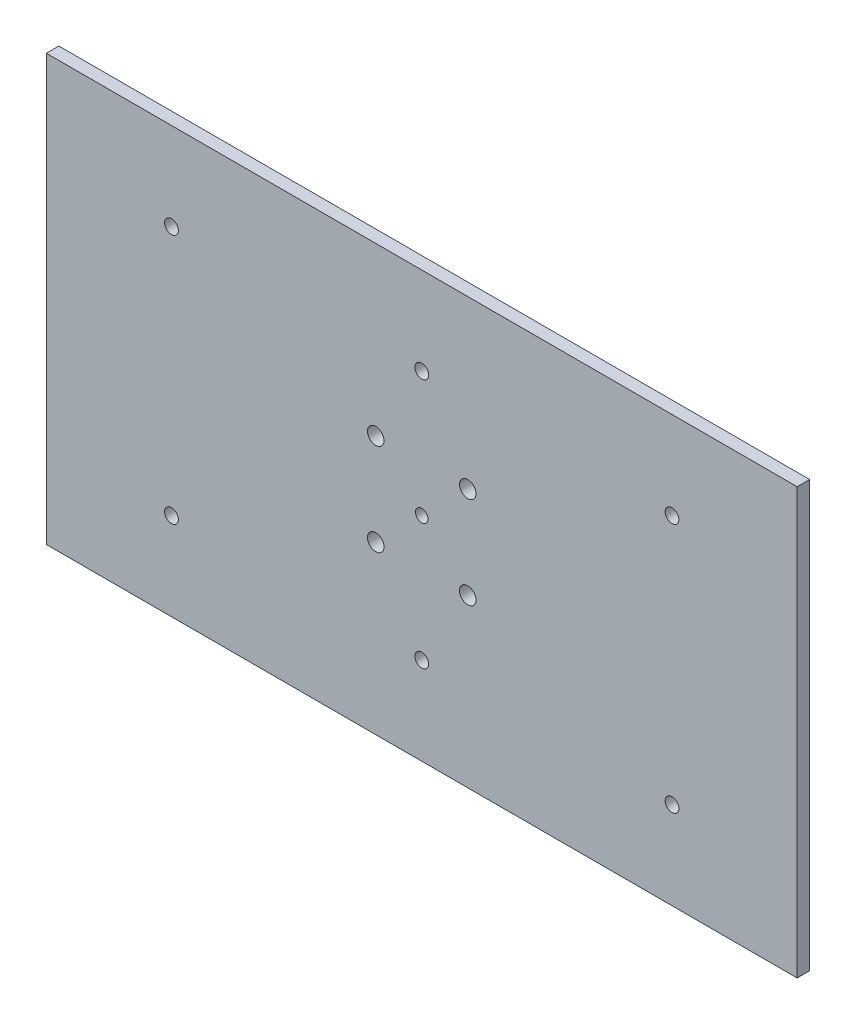
ISO-10303-21;
HEADER;
FILE_DESCRIPTION(('STEP AP214'),'2;1');
FILE_NAME('part.step','',(''),(''),'','','');
FILE_SCHEMA(('AUTOMOTIVE_DESIGN { 1 0 10303 214 1 1 1 1 }'));
ENDSEC;
DATA;
#1=APPLICATION_CONTEXT('core data for automotive mechanical design processes');
#2=APPLICATION_PROTOCOL_DEFINITION('international standard','automotive_design',2000,#1);
#3=PRODUCT_CONTEXT('',#1,'mechanical');
#4=PRODUCT('Part','Part','',(#3));
#5=PRODUCT_RELATED_PRODUCT_CATEGORY('part','',(#4));
#6=PRODUCT_DEFINITION_FORMATION('','',#4);
#7=PRODUCT_DEFINITION_CONTEXT('part definition',#1,'design');
#8=PRODUCT_DEFINITION('design','',#6,#7);
#9=PRODUCT_DEFINITION_SHAPE('','',#8);
#10=(LENGTH_UNIT() NAMED_UNIT(*) SI_UNIT(.MILLI.,.METRE.));
#11=(NAMED_UNIT(*) PLANE_ANGLE_UNIT() SI_UNIT($,.RADIAN.));
#12=(NAMED_UNIT(*) SI_UNIT($,.STERADIAN.) SOLID_ANGLE_UNIT());
#13=UNCERTAINTY_MEASURE_WITH_UNIT(LENGTH_MEASURE(1.E-05),#10,'distance_accuracy_value','');
#14=(GEOMETRIC_REPRESENTATION_CONTEXT(3) GLOBAL_UNCERTAINTY_ASSIGNED_CONTEXT((#13)) GLOBAL_UNIT_ASSIGNED_CONTEXT((#10,
#11,#12)) REPRESENTATION_CONTEXT('',''));
#15=CARTESIAN_POINT('',(0.,0.,0.));
#16=DIRECTION('',(0.,0.,1.));
#17=DIRECTION('',(1.,0.,0.));
#18=AXIS2_PLACEMENT_3D('',#15,#16,#17);
#19=CARTESIAN_POINT('',(0.,0.,5.));
#20=DIRECTION('',(0.,0.,1.));
#21=DIRECTION('',(1.,0.,0.));
#22=AXIS2_PLACEMENT_3D('',#19,#20,#21);
#23=PLANE('',#22);
#24=DIRECTION('',(1.,0.,0.));
#25=VECTOR('',#24,1.);
#26=CARTESIAN_POINT('',(-150.,85.,5.));
#27=LINE('',#26,#25);
#28=CARTESIAN_POINT('',(-150.,85.,5.));
#29=VERTEX_POINT('',#28);
#30=CARTESIAN_POINT('',(150.,85.,5.));
#31=VERTEX_POINT('',#30);
#32=EDGE_CURVE('E56',#29,#31,#27,.T.);
#33=ORIENTED_EDGE('',*,*,#32,.F.);
#34=DIRECTION('',(0.,-1.,0.));
#35=VECTOR('',#34,1.);
#36=CARTESIAN_POINT('',(-150.,-125.,5.));
#37=LINE('',#36,#35);
#38=CARTESIAN_POINT('',(-150.,-85.,5.));
#39=VERTEX_POINT('',#38);
#40=EDGE_CURVE('E48',#29,#39,#37,.T.);
#41=ORIENTED_EDGE('',*,*,#40,.T.);
#42=DIRECTION('',(-1.,0.,0.));
#43=VECTOR('',#42,1.);
#44=CARTESIAN_POINT('',(-150.,-85.,5.));
#45=LINE('',#44,#43);
#46=CARTESIAN_POINT('',(150.,-85.,5.));
#47=VERTEX_POINT('',#46);
#48=EDGE_CURVE('E200',#47,#39,#45,.T.);
#49=ORIENTED_EDGE('',*,*,#48,.F.);
#50=DIRECTION('',(0.,1.,0.));
#51=VECTOR('',#50,1.);
#52=CARTESIAN_POINT('',(150.,-125.,5.));
#53=LINE('',#52,#51);
#54=EDGE_CURVE('E11',#47,#31,#53,.T.);
#55=ORIENTED_EDGE('',*,*,#54,.T.);
#56=EDGE_LOOP('',(#33,#41,#49,#55));
#57=FACE_BOUND('',#56,.T.);
#58=CARTESIAN_POINT('',(-100.,-50.,5.));
#59=DIRECTION('',(0.,0.,1.));
#60=DIRECTION('',(1.,0.,0.));
#61=AXIS2_PLACEMENT_3D('',#58,#59,#60);
#62=CIRCLE('',#61,2.75000000000001);
#63=CARTESIAN_POINT('',(-97.25,-50.,5.));
#64=VERTEX_POINT('',#63);
#65=EDGE_CURVE('E155',#64,#64,#62,.T.);
#66=ORIENTED_EDGE('',*,*,#65,.F.);
#67=EDGE_LOOP('',(#66));
#68=FACE_BOUND('',#67,.T.);
#69=CARTESIAN_POINT('',(0.,-50.,5.));
#70=DIRECTION('',(0.,0.,1.));
#71=DIRECTION('',(1.,0.,0.));
#72=AXIS2_PLACEMENT_3D('',#69,#70,#71);
#73=CIRCLE('',#72,2.75);
#74=CARTESIAN_POINT('',(2.75,-50.,5.));
#75=VERTEX_POINT('',#74);
#76=EDGE_CURVE('E163',#75,#75,#73,.T.);
#77=ORIENTED_EDGE('',*,*,#76,.F.);
#78=EDGE_LOOP('',(#77));
#79=FACE_BOUND('',#78,.T.);
#80=CARTESIAN_POINT('',(100.,-50.,5.));
#81=DIRECTION('',(0.,0.,1.));
#82=DIRECTION('',(1.,0.,0.));
#83=AXIS2_PLACEMENT_3D('',#80,#81,#82);
#84=CIRCLE('',#83,2.75000000000001);
#85=CARTESIAN_POINT('',(102.75,-50.,5.));
#86=VERTEX_POINT('',#85);
#87=EDGE_CURVE('E171',#86,#86,#84,.T.);
#88=ORIENTED_EDGE('',*,*,#87,.F.);
#89=EDGE_LOOP('',(#88));
#90=FACE_BOUND('',#89,.T.);
#91=CARTESIAN_POINT('',(100.,50.,5.));
#92=DIRECTION('',(0.,0.,1.));
#93=DIRECTION('',(1.,0.,0.));
#94=AXIS2_PLACEMENT_3D('',#91,#92,#93);
#95=CIRCLE('',#94,2.75000000000001);
#96=CARTESIAN_POINT('',(102.75,50.,5.));
#97=VERTEX_POINT('',#96);
#98=EDGE_CURVE('E179',#97,#97,#95,.T.);
#99=ORIENTED_EDGE('',*,*,#98,.F.);
#100=EDGE_LOOP('',(#99));
#101=FACE_BOUND('',#100,.T.);
#102=CARTESIAN_POINT('',(0.,50.,5.));
#103=DIRECTION('',(0.,0.,1.));
#104=DIRECTION('',(1.,0.,0.));
#105=AXIS2_PLACEMENT_3D('',#102,#103,#104);
#106=CIRCLE('',#105,2.75);
#107=CARTESIAN_POINT('',(2.75,50.,5.));
#108=VERTEX_POINT('',#107);
#109=EDGE_CURVE('E187',#108,#108,#106,.T.);
#110=ORIENTED_EDGE('',*,*,#109,.F.);
#111=EDGE_LOOP('',(#110));
#112=FACE_BOUND('',#111,.T.);
#113=CARTESIAN_POINT('',(-100.,50.,5.));
#114=DIRECTION('',(0.,0.,1.));
#115=DIRECTION('',(1.,0.,0.));
#116=AXIS2_PLACEMENT_3D('',#113,#114,#115);
#117=CIRCLE('',#116,2.75000000000001);
#118=CARTESIAN_POINT('',(-97.25,50.,5.));
#119=VERTEX_POINT('',#118);
#120=EDGE_CURVE('E147',#119,#119,#117,.T.);
#121=ORIENTED_EDGE('',*,*,#120,.F.);
#122=EDGE_LOOP('',(#121));
#123=FACE_BOUND('',#122,.T.);
#124=CARTESIAN_POINT('',(-18.3847763108501,-18.3847763108503,5.));
#125=DIRECTION('',(0.,0.,1.));
#126=DIRECTION('',(-1.,0.,0.));
#127=AXIS2_PLACEMENT_3D('',#124,#125,#126);
#128=CIRCLE('',#127,3.29999999999999);
#129=CARTESIAN_POINT('',(-21.6847763108501,-18.3847763108503,5.));
#130=VERTEX_POINT('',#129);
#131=EDGE_CURVE('E127',#130,#130,#128,.T.);
#132=ORIENTED_EDGE('',*,*,#131,.F.);
#133=EDGE_LOOP('',(#132));
#134=FACE_BOUND('',#133,.T.);
#135=CARTESIAN_POINT('',(18.38477631085,18.3847763108503,5.));
#136=DIRECTION('',(0.,0.,1.));
#137=DIRECTION('',(-1.,0.,0.));
#138=AXIS2_PLACEMENT_3D('',#135,#136,#137);
#139=CIRCLE('',#138,3.3);
#140=CARTESIAN_POINT('',(15.08477631085,18.3847763108503,5.));
#141=VERTEX_POINT('',#140);
#142=EDGE_CURVE('E113',#141,#141,#139,.T.);
#143=ORIENTED_EDGE('',*,*,#142,.F.);
#144=EDGE_LOOP('',(#143));
#145=FACE_BOUND('',#144,.T.);
#146=CARTESIAN_POINT('',(-18.3847763108501,18.3847763108503,5.));
#147=DIRECTION('',(0.,0.,1.));
#148=DIRECTION('',(1.,0.,0.));
#149=AXIS2_PLACEMENT_3D('',#146,#147,#148);
#150=CIRCLE('',#149,3.3);
#151=CARTESIAN_POINT('',(-15.0847763108501,18.3847763108503,5.));
#152=VERTEX_POINT('',#151);
#153=EDGE_CURVE('E102',#152,#152,#150,.T.);
#154=ORIENTED_EDGE('',*,*,#153,.F.);
#155=EDGE_LOOP('',(#154));
#156=FACE_BOUND('',#155,.T.);
#157=CARTESIAN_POINT('',(18.38477631085,-18.3847763108503,5.));
#158=DIRECTION('',(0.,0.,1.));
#159=DIRECTION('',(1.,0.,0.));
#160=AXIS2_PLACEMENT_3D('',#157,#158,#159);
#161=CIRCLE('',#160,3.3);
#162=CARTESIAN_POINT('',(21.68477631085,-18.3847763108503,5.));
#163=VERTEX_POINT('',#162);
#164=EDGE_CURVE('E119',#163,#163,#161,.T.);
#165=ORIENTED_EDGE('',*,*,#164,.F.);
#166=EDGE_LOOP('',(#165));
#167=FACE_BOUND('',#166,.T.);
#168=CARTESIAN_POINT('',(0.,0.,5.));
#169=DIRECTION('',(0.,0.,1.));
#170=DIRECTION('',(1.,0.,0.));
#171=AXIS2_PLACEMENT_3D('',#168,#169,#170);
#172=CIRCLE('',#171,2.5);
#173=CARTESIAN_POINT('',(2.49999999999992,0.,5.));
#174=VERTEX_POINT('',#173);
#175=EDGE_CURVE('E135',#174,#174,#172,.T.);
#176=ORIENTED_EDGE('',*,*,#175,.F.);
#177=EDGE_LOOP('',(#176));
#178=FACE_BOUND('',#177,.T.);
#179=ADVANCED_FACE('F38',(#57,#68,#79,#90,#101,#112,#123,#134,#145,#156,#167,#178),#23,.T.);
#180=CARTESIAN_POINT('',(0.,0.,0.));
#181=DIRECTION('',(0.,0.,1.));
#182=DIRECTION('',(1.,0.,0.));
#183=AXIS2_PLACEMENT_3D('',#180,#181,#182);
#184=PLANE('',#183);
#185=CARTESIAN_POINT('',(-100.,-50.,0.));
#186=DIRECTION('',(0.,0.,1.));
#187=DIRECTION('',(1.,0.,0.));
#188=AXIS2_PLACEMENT_3D('',#185,#186,#187);
#189=CIRCLE('',#188,2.75000000000001);
#190=CARTESIAN_POINT('',(-97.25,-50.,0.));
#191=VERTEX_POINT('',#190);
#192=EDGE_CURVE('E159',#191,#191,#189,.T.);
#193=ORIENTED_EDGE('',*,*,#192,.T.);
#194=EDGE_LOOP('',(#193));
#195=FACE_BOUND('',#194,.T.);
#196=CARTESIAN_POINT('',(0.,-50.,0.));
#197=DIRECTION('',(0.,0.,1.));
#198=DIRECTION('',(1.,0.,0.));
#199=AXIS2_PLACEMENT_3D('',#196,#197,#198);
#200=CIRCLE('',#199,2.75);
#201=CARTESIAN_POINT('',(2.75,-50.,0.));
#202=VERTEX_POINT('',#201);
#203=EDGE_CURVE('E167',#202,#202,#200,.T.);
#204=ORIENTED_EDGE('',*,*,#203,.T.);
#205=EDGE_LOOP('',(#204));
#206=FACE_BOUND('',#205,.T.);
#207=CARTESIAN_POINT('',(100.,-50.,0.));
#208=DIRECTION('',(0.,0.,1.));
#209=DIRECTION('',(1.,0.,0.));
#210=AXIS2_PLACEMENT_3D('',#207,#208,#209);
#211=CIRCLE('',#210,2.75000000000001);
#212=CARTESIAN_POINT('',(102.75,-50.,0.));
#213=VERTEX_POINT('',#212);
#214=EDGE_CURVE('E175',#213,#213,#211,.T.);
#215=ORIENTED_EDGE('',*,*,#214,.T.);
#216=EDGE_LOOP('',(#215));
#217=FACE_BOUND('',#216,.T.);
#218=CARTESIAN_POINT('',(100.,50.,0.));
#219=DIRECTION('',(0.,0.,1.));
#220=DIRECTION('',(1.,0.,0.));
#221=AXIS2_PLACEMENT_3D('',#218,#219,#220);
#222=CIRCLE('',#221,2.75000000000001);
#223=CARTESIAN_POINT('',(102.75,50.,0.));
#224=VERTEX_POINT('',#223);
#225=EDGE_CURVE('E183',#224,#224,#222,.T.);
#226=ORIENTED_EDGE('',*,*,#225,.T.);
#227=EDGE_LOOP('',(#226));
#228=FACE_BOUND('',#227,.T.);
#229=CARTESIAN_POINT('',(0.,50.,0.));
#230=DIRECTION('',(0.,0.,1.));
#231=DIRECTION('',(1.,0.,0.));
#232=AXIS2_PLACEMENT_3D('',#229,#230,#231);
#233=CIRCLE('',#232,2.75);
#234=CARTESIAN_POINT('',(2.75,50.,0.));
#235=VERTEX_POINT('',#234);
#236=EDGE_CURVE('E151',#235,#235,#233,.T.);
#237=ORIENTED_EDGE('',*,*,#236,.T.);
#238=EDGE_LOOP('',(#237));
#239=FACE_BOUND('',#238,.T.);
#240=CARTESIAN_POINT('',(-100.,50.,0.));
#241=DIRECTION('',(0.,0.,1.));
#242=DIRECTION('',(1.,0.,0.));
#243=AXIS2_PLACEMENT_3D('',#240,#241,#242);
#244=CIRCLE('',#243,2.75000000000001);
#245=CARTESIAN_POINT('',(-97.25,50.,0.));
#246=VERTEX_POINT('',#245);
#247=EDGE_CURVE('E143',#246,#246,#244,.T.);
#248=ORIENTED_EDGE('',*,*,#247,.T.);
#249=EDGE_LOOP('',(#248));
#250=FACE_BOUND('',#249,.T.);
#251=DIRECTION('',(0.,-1.,0.));
#252=VECTOR('',#251,1.);
#253=CARTESIAN_POINT('',(-150.,-125.,0.));
#254=LINE('',#253,#252);
#255=CARTESIAN_POINT('',(-150.,85.,0.));
#256=VERTEX_POINT('',#255);
#257=CARTESIAN_POINT('',(-150.,-85.,0.));
#258=VERTEX_POINT('',#257);
#259=EDGE_CURVE('E95',#256,#258,#254,.T.);
#260=ORIENTED_EDGE('',*,*,#259,.F.);
#261=DIRECTION('',(1.,0.,0.));
#262=VECTOR('',#261,1.);
#263=CARTESIAN_POINT('',(-150.,85.,0.));
#264=LINE('',#263,#262);
#265=CARTESIAN_POINT('',(150.,85.,0.));
#266=VERTEX_POINT('',#265);
#267=EDGE_CURVE('E80',#256,#266,#264,.T.);
#268=ORIENTED_EDGE('',*,*,#267,.T.);
#269=DIRECTION('',(0.,1.,0.));
#270=VECTOR('',#269,1.);
#271=CARTESIAN_POINT('',(150.,-125.,0.));
#272=LINE('',#271,#270);
#273=CARTESIAN_POINT('',(150.,-85.,0.));
#274=VERTEX_POINT('',#273);
#275=EDGE_CURVE('E42',#274,#266,#272,.T.);
#276=ORIENTED_EDGE('',*,*,#275,.F.);
#277=DIRECTION('',(-1.,0.,0.));
#278=VECTOR('',#277,1.);
#279=CARTESIAN_POINT('',(-150.,-85.,0.));
#280=LINE('',#279,#278);
#281=EDGE_CURVE('E64',#274,#258,#280,.T.);
#282=ORIENTED_EDGE('',*,*,#281,.T.);
#283=EDGE_LOOP('',(#260,#268,#276,#282));
#284=FACE_BOUND('',#283,.T.);
#285=CARTESIAN_POINT('',(-18.3847763108501,18.3847763108503,0.));
#286=DIRECTION('',(0.,0.,1.));
#287=DIRECTION('',(1.,0.,0.));
#288=AXIS2_PLACEMENT_3D('',#285,#286,#287);
#289=CIRCLE('',#288,3.3);
#290=CARTESIAN_POINT('',(-15.0847763108501,18.3847763108503,0.));
#291=VERTEX_POINT('',#290);
#292=EDGE_CURVE('E106',#291,#291,#289,.T.);
#293=ORIENTED_EDGE('',*,*,#292,.T.);
#294=EDGE_LOOP('',(#293));
#295=FACE_BOUND('',#294,.T.);
#296=CARTESIAN_POINT('',(18.38477631085,18.3847763108503,0.));
#297=DIRECTION('',(0.,0.,1.));
#298=DIRECTION('',(-1.,0.,0.));
#299=AXIS2_PLACEMENT_3D('',#296,#297,#298);
#300=CIRCLE('',#299,3.3);
#301=CARTESIAN_POINT('',(15.08477631085,18.3847763108503,0.));
#302=VERTEX_POINT('',#301);
#303=EDGE_CURVE('E115',#302,#302,#300,.T.);
#304=ORIENTED_EDGE('',*,*,#303,.T.);
#305=EDGE_LOOP('',(#304));
#306=FACE_BOUND('',#305,.T.);
#307=CARTESIAN_POINT('',(18.38477631085,-18.3847763108503,0.));
#308=DIRECTION('',(0.,0.,1.));
#309=DIRECTION('',(1.,0.,0.));
#310=AXIS2_PLACEMENT_3D('',#307,#308,#309);
#311=CIRCLE('',#310,3.3);
#312=CARTESIAN_POINT('',(21.68477631085,-18.3847763108503,0.));
#313=VERTEX_POINT('',#312);
#314=EDGE_CURVE('E123',#313,#313,#311,.T.);
#315=ORIENTED_EDGE('',*,*,#314,.T.);
#316=EDGE_LOOP('',(#315));
#317=FACE_BOUND('',#316,.T.);
#318=CARTESIAN_POINT('',(-18.3847763108501,-18.3847763108503,0.));
#319=DIRECTION('',(0.,0.,1.));
#320=DIRECTION('',(-1.,0.,0.));
#321=AXIS2_PLACEMENT_3D('',#318,#319,#320);
#322=CIRCLE('',#321,3.29999999999999);
#323=CARTESIAN_POINT('',(-21.6847763108501,-18.3847763108503,0.));
#324=VERTEX_POINT('',#323);
#325=EDGE_CURVE('E131',#324,#324,#322,.T.);
#326=ORIENTED_EDGE('',*,*,#325,.T.);
#327=EDGE_LOOP('',(#326));
#328=FACE_BOUND('',#327,.T.);
#329=CARTESIAN_POINT('',(0.,0.,0.));
#330=DIRECTION('',(0.,0.,1.));
#331=DIRECTION('',(1.,0.,0.));
#332=AXIS2_PLACEMENT_3D('',#329,#330,#331);
#333=CIRCLE('',#332,2.5);
#334=CARTESIAN_POINT('',(2.49999999999992,0.,0.));
#335=VERTEX_POINT('',#334);
#336=EDGE_CURVE('E139',#335,#335,#333,.T.);
#337=ORIENTED_EDGE('',*,*,#336,.T.);
#338=EDGE_LOOP('',(#337));
#339=FACE_BOUND('',#338,.T.);
#340=ADVANCED_FACE('F99',(#195,#206,#217,#228,#239,#250,#284,#295,#306,#317,#328,#339),#184,.F.);
#341=CARTESIAN_POINT('',(-150.,-125.,5.));
#342=DIRECTION('',(1.,0.,0.));
#343=DIRECTION('',(0.,0.,-1.));
#344=AXIS2_PLACEMENT_3D('',#341,#342,#343);
#345=PLANE('',#344);
#346=ORIENTED_EDGE('',*,*,#40,.F.);
#347=DIRECTION('',(0.,0.,1.));
#348=VECTOR('',#347,1.);
#349=CARTESIAN_POINT('',(-150.,85.,0.));
#350=LINE('',#349,#348);
#351=EDGE_CURVE('E83',#256,#29,#350,.T.);
#352=ORIENTED_EDGE('',*,*,#351,.F.);
#353=ORIENTED_EDGE('',*,*,#259,.T.);
#354=DIRECTION('',(0.,0.,1.));
#355=VECTOR('',#354,1.);
#356=CARTESIAN_POINT('',(-150.,-85.,0.));
#357=LINE('',#356,#355);
#358=EDGE_CURVE('E197',#258,#39,#357,.T.);
#359=ORIENTED_EDGE('',*,*,#358,.T.);
#360=EDGE_LOOP('',(#346,#352,#353,#359));
#361=FACE_BOUND('',#360,.T.);
#362=ADVANCED_FACE('F40',(#361),#345,.F.);
#363=CARTESIAN_POINT('',(150.,-125.,5.));
#364=DIRECTION('',(-1.,0.,0.));
#365=DIRECTION('',(0.,-1.,0.));
#366=AXIS2_PLACEMENT_3D('',#363,#364,#365);
#367=PLANE('',#366);
#368=ORIENTED_EDGE('',*,*,#275,.T.);
#369=DIRECTION('',(0.,0.,1.));
#370=VECTOR('',#369,1.);
#371=CARTESIAN_POINT('',(150.,85.,0.));
#372=LINE('',#371,#370);
#373=EDGE_CURVE('E84',#266,#31,#372,.T.);
#374=ORIENTED_EDGE('',*,*,#373,.T.);
#375=ORIENTED_EDGE('',*,*,#54,.F.);
#376=DIRECTION('',(0.,0.,1.));
#377=VECTOR('',#376,1.);
#378=CARTESIAN_POINT('',(150.,-85.,0.));
#379=LINE('',#378,#377);
#380=EDGE_CURVE('E194',#274,#47,#379,.T.);
#381=ORIENTED_EDGE('',*,*,#380,.F.);
#382=EDGE_LOOP('',(#368,#374,#375,#381));
#383=FACE_BOUND('',#382,.T.);
#384=ADVANCED_FACE('F210',(#383),#367,.F.);
#385=CARTESIAN_POINT('',(-18.3847763108501,18.3847763108503,5.));
#386=DIRECTION('',(0.,0.,-1.));
#387=DIRECTION('',(-1.,0.,0.));
#388=AXIS2_PLACEMENT_3D('',#385,#386,#387);
#389=CYLINDRICAL_SURFACE('',#388,3.3);
#390=ORIENTED_EDGE('',*,*,#153,.T.);
#391=EDGE_LOOP('',(#390));
#392=FACE_BOUND('',#391,.T.);
#393=ORIENTED_EDGE('',*,*,#292,.F.);
#394=EDGE_LOOP('',(#393));
#395=FACE_BOUND('',#394,.T.);
#396=ADVANCED_FACE('F235',(#392,#395),#389,.F.);
#397=CARTESIAN_POINT('',(18.38477631085,18.3847763108503,5.));
#398=DIRECTION('',(0.,0.,-1.));
#399=DIRECTION('',(-1.,0.,0.));
#400=AXIS2_PLACEMENT_3D('',#397,#398,#399);
#401=CYLINDRICAL_SURFACE('',#400,3.3);
#402=ORIENTED_EDGE('',*,*,#142,.T.);
#403=EDGE_LOOP('',(#402));
#404=FACE_BOUND('',#403,.T.);
#405=ORIENTED_EDGE('',*,*,#303,.F.);
#406=EDGE_LOOP('',(#405));
#407=FACE_BOUND('',#406,.T.);
#408=ADVANCED_FACE('F242',(#404,#407),#401,.F.);
#409=CARTESIAN_POINT('',(18.38477631085,-18.3847763108503,5.));
#410=DIRECTION('',(0.,0.,-1.));
#411=DIRECTION('',(-1.,0.,0.));
#412=AXIS2_PLACEMENT_3D('',#409,#410,#411);
#413=CYLINDRICAL_SURFACE('',#412,3.3);
#414=ORIENTED_EDGE('',*,*,#164,.T.);
#415=EDGE_LOOP('',(#414));
#416=FACE_BOUND('',#415,.T.);
#417=ORIENTED_EDGE('',*,*,#314,.F.);
#418=EDGE_LOOP('',(#417));
#419=FACE_BOUND('',#418,.T.);
#420=ADVANCED_FACE('F329',(#416,#419),#413,.F.);
#421=CARTESIAN_POINT('',(-18.3847763108501,-18.3847763108503,5.));
#422=DIRECTION('',(0.,0.,-1.));
#423=DIRECTION('',(-1.,0.,0.));
#424=AXIS2_PLACEMENT_3D('',#421,#422,#423);
#425=CYLINDRICAL_SURFACE('',#424,3.29999999999999);
#426=ORIENTED_EDGE('',*,*,#131,.T.);
#427=EDGE_LOOP('',(#426));
#428=FACE_BOUND('',#427,.T.);
#429=ORIENTED_EDGE('',*,*,#325,.F.);
#430=EDGE_LOOP('',(#429));
#431=FACE_BOUND('',#430,.T.);
#432=ADVANCED_FACE('F319',(#428,#431),#425,.F.);
#433=CARTESIAN_POINT('',(0.,0.,5.));
#434=DIRECTION('',(0.,0.,-1.));
#435=DIRECTION('',(-1.,0.,0.));
#436=AXIS2_PLACEMENT_3D('',#433,#434,#435);
#437=CYLINDRICAL_SURFACE('',#436,2.5);
#438=ORIENTED_EDGE('',*,*,#175,.T.);
#439=EDGE_LOOP('',(#438));
#440=FACE_BOUND('',#439,.T.);
#441=ORIENTED_EDGE('',*,*,#336,.F.);
#442=EDGE_LOOP('',(#441));
#443=FACE_BOUND('',#442,.T.);
#444=ADVANCED_FACE('F309',(#440,#443),#437,.F.);
#445=CARTESIAN_POINT('',(-100.,50.,0.));
#446=DIRECTION('',(0.,0.,1.));
#447=DIRECTION('',(1.,0.,0.));
#448=AXIS2_PLACEMENT_3D('',#445,#446,#447);
#449=CYLINDRICAL_SURFACE('',#448,2.75000000000001);
#450=ORIENTED_EDGE('',*,*,#247,.F.);
#451=EDGE_LOOP('',(#450));
#452=FACE_BOUND('',#451,.T.);
#453=ORIENTED_EDGE('',*,*,#120,.T.);
#454=EDGE_LOOP('',(#453));
#455=FACE_BOUND('',#454,.T.);
#456=ADVANCED_FACE('F300',(#452,#455),#449,.F.);
#457=CARTESIAN_POINT('',(0.,50.,0.));
#458=DIRECTION('',(0.,0.,1.));
#459=DIRECTION('',(1.,0.,0.));
#460=AXIS2_PLACEMENT_3D('',#457,#458,#459);
#461=CYLINDRICAL_SURFACE('',#460,2.75);
#462=ORIENTED_EDGE('',*,*,#236,.F.);
#463=EDGE_LOOP('',(#462));
#464=FACE_BOUND('',#463,.T.);
#465=ORIENTED_EDGE('',*,*,#109,.T.);
#466=EDGE_LOOP('',(#465));
#467=FACE_BOUND('',#466,.T.);
#468=ADVANCED_FACE('F290',(#464,#467),#461,.F.);
#469=CARTESIAN_POINT('',(100.,50.,0.));
#470=DIRECTION('',(0.,0.,1.));
#471=DIRECTION('',(1.,0.,0.));
#472=AXIS2_PLACEMENT_3D('',#469,#470,#471);
#473=CYLINDRICAL_SURFACE('',#472,2.75000000000001);
#474=ORIENTED_EDGE('',*,*,#225,.F.);
#475=EDGE_LOOP('',(#474));
#476=FACE_BOUND('',#475,.T.);
#477=ORIENTED_EDGE('',*,*,#98,.T.);
#478=EDGE_LOOP('',(#477));
#479=FACE_BOUND('',#478,.T.);
#480=ADVANCED_FACE('F280',(#476,#479),#473,.F.);
#481=CARTESIAN_POINT('',(100.,-50.,0.));
#482=DIRECTION('',(0.,0.,1.));
#483=DIRECTION('',(1.,0.,0.));
#484=AXIS2_PLACEMENT_3D('',#481,#482,#483);
#485=CYLINDRICAL_SURFACE('',#484,2.75000000000001);
#486=ORIENTED_EDGE('',*,*,#214,.F.);
#487=EDGE_LOOP('',(#486));
#488=FACE_BOUND('',#487,.T.);
#489=ORIENTED_EDGE('',*,*,#87,.T.);
#490=EDGE_LOOP('',(#489));
#491=FACE_BOUND('',#490,.T.);
#492=ADVANCED_FACE('F270',(#488,#491),#485,.F.);
#493=CARTESIAN_POINT('',(0.,-50.,0.));
#494=DIRECTION('',(0.,0.,1.));
#495=DIRECTION('',(1.,0.,0.));
#496=AXIS2_PLACEMENT_3D('',#493,#494,#495);
#497=CYLINDRICAL_SURFACE('',#496,2.75);
#498=ORIENTED_EDGE('',*,*,#203,.F.);
#499=EDGE_LOOP('',(#498));
#500=FACE_BOUND('',#499,.T.);
#501=ORIENTED_EDGE('',*,*,#76,.T.);
#502=EDGE_LOOP('',(#501));
#503=FACE_BOUND('',#502,.T.);
#504=ADVANCED_FACE('F223',(#500,#503),#497,.F.);
#505=CARTESIAN_POINT('',(-100.,-50.,0.));
#506=DIRECTION('',(0.,0.,1.));
#507=DIRECTION('',(1.,0.,0.));
#508=AXIS2_PLACEMENT_3D('',#505,#506,#507);
#509=CYLINDRICAL_SURFACE('',#508,2.75000000000001);
#510=ORIENTED_EDGE('',*,*,#192,.F.);
#511=EDGE_LOOP('',(#510));
#512=FACE_BOUND('',#511,.T.);
#513=ORIENTED_EDGE('',*,*,#65,.T.);
#514=EDGE_LOOP('',(#513));
#515=FACE_BOUND('',#514,.T.);
#516=ADVANCED_FACE('F216',(#512,#515),#509,.F.);
#517=CARTESIAN_POINT('',(-150.,-85.,0.));
#518=DIRECTION('',(0.,1.,0.));
#519=DIRECTION('',(0.,0.,1.));
#520=AXIS2_PLACEMENT_3D('',#517,#518,#519);
#521=PLANE('',#520);
#522=ORIENTED_EDGE('',*,*,#48,.T.);
#523=ORIENTED_EDGE('',*,*,#358,.F.);
#524=ORIENTED_EDGE('',*,*,#281,.F.);
#525=ORIENTED_EDGE('',*,*,#380,.T.);
#526=EDGE_LOOP('',(#522,#523,#524,#525));
#527=FACE_BOUND('',#526,.T.);
#528=ADVANCED_FACE('F214',(#527),#521,.F.);
#529=CARTESIAN_POINT('',(-150.,85.,0.));
#530=DIRECTION('',(0.,-1.,0.));
#531=DIRECTION('',(1.,0.,0.));
#532=AXIS2_PLACEMENT_3D('',#529,#530,#531);
#533=PLANE('',#532);
#534=ORIENTED_EDGE('',*,*,#32,.T.);
#535=ORIENTED_EDGE('',*,*,#373,.F.);
#536=ORIENTED_EDGE('',*,*,#267,.F.);
#537=ORIENTED_EDGE('',*,*,#351,.T.);
#538=EDGE_LOOP('',(#534,#535,#536,#537));
#539=FACE_BOUND('',#538,.T.);
#540=ADVANCED_FACE('F82',(#539),#533,.F.);
#541=CLOSED_SHELL('',(#179,#340,#362,#384,#396,#408,#420,#432,#444,#456,#468,#480,#492,#504,
#516,#528,#540));
#542=MANIFOLD_SOLID_BREP('B2',#541);
#543=ADVANCED_BREP_SHAPE_REPRESENTATION('',(#18,#542),#14);
#544=SHAPE_DEFINITION_REPRESENTATION(#9,#543);
ENDSEC;
END-ISO-10303-21;
